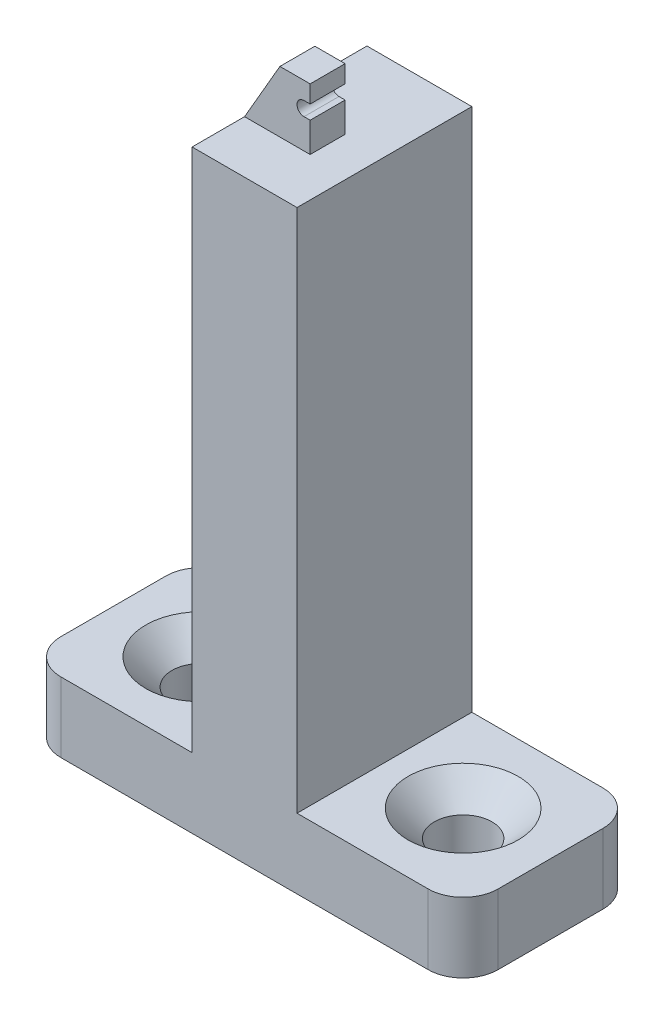
ISO-10303-21;
HEADER;
FILE_DESCRIPTION(('STEP AP214'),'2;1');
FILE_NAME('part.step','',(''),(''),'','','');
FILE_SCHEMA(('AUTOMOTIVE_DESIGN { 1 0 10303 214 1 1 1 1 }'));
ENDSEC;
DATA;
#1=APPLICATION_CONTEXT('core data for automotive mechanical design processes');
#2=APPLICATION_PROTOCOL_DEFINITION('international standard','automotive_design',2000,#1);
#3=PRODUCT_CONTEXT('',#1,'mechanical');
#4=PRODUCT('Part','Part','',(#3));
#5=PRODUCT_RELATED_PRODUCT_CATEGORY('part','',(#4));
#6=PRODUCT_DEFINITION_FORMATION('','',#4);
#7=PRODUCT_DEFINITION_CONTEXT('part definition',#1,'design');
#8=PRODUCT_DEFINITION('design','',#6,#7);
#9=PRODUCT_DEFINITION_SHAPE('','',#8);
#10=(LENGTH_UNIT() NAMED_UNIT(*) SI_UNIT(.MILLI.,.METRE.));
#11=(NAMED_UNIT(*) PLANE_ANGLE_UNIT() SI_UNIT($,.RADIAN.));
#12=(NAMED_UNIT(*) SI_UNIT($,.STERADIAN.) SOLID_ANGLE_UNIT());
#13=UNCERTAINTY_MEASURE_WITH_UNIT(LENGTH_MEASURE(1.E-05),#10,'distance_accuracy_value','');
#14=(GEOMETRIC_REPRESENTATION_CONTEXT(3) GLOBAL_UNCERTAINTY_ASSIGNED_CONTEXT((#13)) GLOBAL_UNIT_ASSIGNED_CONTEXT((#10,
#11,#12)) REPRESENTATION_CONTEXT('',''));
#15=CARTESIAN_POINT('',(0.,0.,0.));
#16=DIRECTION('',(0.,0.,1.));
#17=DIRECTION('',(1.,0.,0.));
#18=AXIS2_PLACEMENT_3D('',#15,#16,#17);
#19=CARTESIAN_POINT('',(0.,8.,0.));
#20=DIRECTION('',(0.,-1.,0.));
#21=DIRECTION('',(0.,0.,-1.));
#22=AXIS2_PLACEMENT_3D('',#19,#20,#21);
#23=PLANE('',#22);
#24=CARTESIAN_POINT('',(-15.,8.,0.));
#25=DIRECTION('',(0.,1.,0.));
#26=DIRECTION('',(0.,0.,1.));
#27=AXIS2_PLACEMENT_3D('',#24,#25,#26);
#28=CIRCLE('',#27,6.3);
#29=CARTESIAN_POINT('',(-15.,8.,6.3));
#30=VERTEX_POINT('',#29);
#31=EDGE_CURVE('E266',#30,#30,#28,.T.);
#32=ORIENTED_EDGE('',*,*,#31,.F.);
#33=EDGE_LOOP('',(#32));
#34=FACE_BOUND('',#33,.T.);
#35=DIRECTION('',(0.,0.,1.));
#36=VECTOR('',#35,1.);
#37=CARTESIAN_POINT('',(-6.,8.,-10.));
#38=LINE('',#37,#36);
#39=CARTESIAN_POINT('',(-6.,8.,-10.));
#40=VERTEX_POINT('',#39);
#41=CARTESIAN_POINT('',(-6.,8.,10.));
#42=VERTEX_POINT('',#41);
#43=EDGE_CURVE('E178',#40,#42,#38,.T.);
#44=ORIENTED_EDGE('',*,*,#43,.F.);
#45=DIRECTION('',(-1.,0.,0.));
#46=VECTOR('',#45,1.);
#47=CARTESIAN_POINT('',(25.,8.,-10.));
#48=LINE('',#47,#46);
#49=CARTESIAN_POINT('',(-21.,8.,-10.));
#50=VERTEX_POINT('',#49);
#51=EDGE_CURVE('E295',#40,#50,#48,.T.);
#52=ORIENTED_EDGE('',*,*,#51,.T.);
#53=CARTESIAN_POINT('',(-21.,8.,-6.));
#54=DIRECTION('',(0.,-1.,0.));
#55=DIRECTION('',(0.,0.,-1.));
#56=AXIS2_PLACEMENT_3D('',#53,#54,#55);
#57=CIRCLE('',#56,4.);
#58=CARTESIAN_POINT('',(-25.,8.,-6.));
#59=VERTEX_POINT('',#58);
#60=EDGE_CURVE('E329',#50,#59,#57,.F.);
#61=ORIENTED_EDGE('',*,*,#60,.T.);
#62=DIRECTION('',(0.,0.,1.));
#63=VECTOR('',#62,1.);
#64=CARTESIAN_POINT('',(-25.,8.,-10.));
#65=LINE('',#64,#63);
#66=CARTESIAN_POINT('',(-25.,8.,6.));
#67=VERTEX_POINT('',#66);
#68=EDGE_CURVE('E285',#59,#67,#65,.T.);
#69=ORIENTED_EDGE('',*,*,#68,.T.);
#70=CARTESIAN_POINT('',(-21.,8.,6.));
#71=DIRECTION('',(0.,-1.,0.));
#72=DIRECTION('',(0.,0.,-1.));
#73=AXIS2_PLACEMENT_3D('',#70,#71,#72);
#74=CIRCLE('',#73,4.);
#75=CARTESIAN_POINT('',(-21.,8.,10.));
#76=VERTEX_POINT('',#75);
#77=EDGE_CURVE('E327',#67,#76,#74,.F.);
#78=ORIENTED_EDGE('',*,*,#77,.T.);
#79=DIRECTION('',(1.,0.,0.));
#80=VECTOR('',#79,1.);
#81=CARTESIAN_POINT('',(25.,8.,9.99999999999999));
#82=LINE('',#81,#80);
#83=EDGE_CURVE('E290',#76,#42,#82,.T.);
#84=ORIENTED_EDGE('',*,*,#83,.T.);
#85=EDGE_LOOP('',(#44,#52,#61,#69,#78,#84));
#86=FACE_BOUND('',#85,.T.);
#87=ADVANCED_FACE('F39',(#34,#86),#23,.F.);
#88=CARTESIAN_POINT('',(15.,8.,0.));
#89=DIRECTION('',(0.,1.,0.));
#90=DIRECTION('',(0.,0.,1.));
#91=AXIS2_PLACEMENT_3D('',#88,#89,#90);
#92=CIRCLE('',#91,6.3);
#93=CARTESIAN_POINT('',(15.,8.,6.3));
#94=VERTEX_POINT('',#93);
#95=EDGE_CURVE('E275',#94,#94,#92,.T.);
#96=ORIENTED_EDGE('',*,*,#95,.F.);
#97=EDGE_LOOP('',(#96));
#98=FACE_BOUND('',#97,.T.);
#99=DIRECTION('',(0.,0.,-1.));
#100=VECTOR('',#99,1.);
#101=CARTESIAN_POINT('',(6.,8.,-10.));
#102=LINE('',#101,#100);
#103=CARTESIAN_POINT('',(6.,8.,10.));
#104=VERTEX_POINT('',#103);
#105=CARTESIAN_POINT('',(6.,8.,-10.));
#106=VERTEX_POINT('',#105);
#107=EDGE_CURVE('E252',#104,#106,#102,.T.);
#108=ORIENTED_EDGE('',*,*,#107,.F.);
#109=CARTESIAN_POINT('',(21.,8.,9.99999999999999));
#110=VERTEX_POINT('',#109);
#111=EDGE_CURVE('E288',#104,#110,#82,.T.);
#112=ORIENTED_EDGE('',*,*,#111,.T.);
#113=CARTESIAN_POINT('',(21.,8.,5.99999999999999));
#114=DIRECTION('',(0.,-1.,0.));
#115=DIRECTION('',(0.,0.,-1.));
#116=AXIS2_PLACEMENT_3D('',#113,#114,#115);
#117=CIRCLE('',#116,4.);
#118=CARTESIAN_POINT('',(25.,8.,5.99999999999999));
#119=VERTEX_POINT('',#118);
#120=EDGE_CURVE('E331',#110,#119,#117,.F.);
#121=ORIENTED_EDGE('',*,*,#120,.T.);
#122=DIRECTION('',(0.,0.,-1.));
#123=VECTOR('',#122,1.);
#124=CARTESIAN_POINT('',(25.,8.,-10.));
#125=LINE('',#124,#123);
#126=CARTESIAN_POINT('',(25.,8.,-6.00000000000001));
#127=VERTEX_POINT('',#126);
#128=EDGE_CURVE('E292',#119,#127,#125,.T.);
#129=ORIENTED_EDGE('',*,*,#128,.T.);
#130=CARTESIAN_POINT('',(21.,8.,-6.));
#131=DIRECTION('',(0.,-1.,0.));
#132=DIRECTION('',(0.,0.,-1.));
#133=AXIS2_PLACEMENT_3D('',#130,#131,#132);
#134=CIRCLE('',#133,4.);
#135=CARTESIAN_POINT('',(21.,8.,-10.));
#136=VERTEX_POINT('',#135);
#137=EDGE_CURVE('E333',#127,#136,#134,.F.);
#138=ORIENTED_EDGE('',*,*,#137,.T.);
#139=EDGE_CURVE('E296',#136,#106,#48,.T.);
#140=ORIENTED_EDGE('',*,*,#139,.T.);
#141=EDGE_LOOP('',(#108,#112,#121,#129,#138,#140));
#142=FACE_BOUND('',#141,.T.);
#143=ADVANCED_FACE('F370',(#98,#142),#23,.F.);
#144=CARTESIAN_POINT('',(-25.,8.,-10.));
#145=DIRECTION('',(1.,0.,0.));
#146=DIRECTION('',(0.,0.,-1.));
#147=AXIS2_PLACEMENT_3D('',#144,#145,#146);
#148=PLANE('',#147);
#149=ORIENTED_EDGE('',*,*,#68,.F.);
#150=DIRECTION('',(0.,-1.,0.));
#151=VECTOR('',#150,1.);
#152=CARTESIAN_POINT('',(-25.,8.,-6.));
#153=LINE('',#152,#151);
#154=CARTESIAN_POINT('',(-25.,0.,-6.));
#155=VERTEX_POINT('',#154);
#156=EDGE_CURVE('E11',#59,#155,#153,.T.);
#157=ORIENTED_EDGE('',*,*,#156,.T.);
#158=DIRECTION('',(0.,0.,1.));
#159=VECTOR('',#158,1.);
#160=CARTESIAN_POINT('',(-25.,0.,-10.));
#161=LINE('',#160,#159);
#162=CARTESIAN_POINT('',(-25.,0.,6.));
#163=VERTEX_POINT('',#162);
#164=EDGE_CURVE('E284',#155,#163,#161,.T.);
#165=ORIENTED_EDGE('',*,*,#164,.T.);
#166=DIRECTION('',(0.,-1.,0.));
#167=VECTOR('',#166,1.);
#168=CARTESIAN_POINT('',(-25.,8.,6.));
#169=LINE('',#168,#167);
#170=EDGE_CURVE('E47',#163,#67,#169,.F.);
#171=ORIENTED_EDGE('',*,*,#170,.T.);
#172=EDGE_LOOP('',(#149,#157,#165,#171));
#173=FACE_BOUND('',#172,.T.);
#174=ADVANCED_FACE('F343',(#173),#148,.F.);
#175=CARTESIAN_POINT('',(25.,8.,9.99999999999999));
#176=DIRECTION('',(0.,0.,-1.));
#177=DIRECTION('',(-1.,0.,0.));
#178=AXIS2_PLACEMENT_3D('',#175,#176,#177);
#179=PLANE('',#178);
#180=DIRECTION('',(1.,0.,0.));
#181=VECTOR('',#180,1.);
#182=CARTESIAN_POINT('',(25.,0.,9.99999999999999));
#183=LINE('',#182,#181);
#184=CARTESIAN_POINT('',(-21.,0.,10.));
#185=VERTEX_POINT('',#184);
#186=CARTESIAN_POINT('',(21.,0.,9.99999999999999));
#187=VERTEX_POINT('',#186);
#188=EDGE_CURVE('E301',#185,#187,#183,.T.);
#189=ORIENTED_EDGE('',*,*,#188,.T.);
#190=DIRECTION('',(0.,-1.,0.));
#191=VECTOR('',#190,1.);
#192=CARTESIAN_POINT('',(21.,8.,9.99999999999999));
#193=LINE('',#192,#191);
#194=EDGE_CURVE('E338',#187,#110,#193,.F.);
#195=ORIENTED_EDGE('',*,*,#194,.T.);
#196=ORIENTED_EDGE('',*,*,#111,.F.);
#197=DIRECTION('',(0.,-1.,0.));
#198=VECTOR('',#197,1.);
#199=CARTESIAN_POINT('',(6.,68.,10.));
#200=LINE('',#199,#198);
#201=CARTESIAN_POINT('',(6.,68.,10.));
#202=VERTEX_POINT('',#201);
#203=EDGE_CURVE('E260',#202,#104,#200,.T.);
#204=ORIENTED_EDGE('',*,*,#203,.F.);
#205=DIRECTION('',(1.,0.,0.));
#206=VECTOR('',#205,1.);
#207=CARTESIAN_POINT('',(6.,68.,10.));
#208=LINE('',#207,#206);
#209=CARTESIAN_POINT('',(-6.,68.,10.));
#210=VERTEX_POINT('',#209);
#211=EDGE_CURVE('E242',#210,#202,#208,.T.);
#212=ORIENTED_EDGE('',*,*,#211,.F.);
#213=DIRECTION('',(0.,-1.,0.));
#214=VECTOR('',#213,1.);
#215=CARTESIAN_POINT('',(-6.,68.,10.));
#216=LINE('',#215,#214);
#217=EDGE_CURVE('E263',#210,#42,#216,.T.);
#218=ORIENTED_EDGE('',*,*,#217,.T.);
#219=ORIENTED_EDGE('',*,*,#83,.F.);
#220=DIRECTION('',(0.,-1.,0.));
#221=VECTOR('',#220,1.);
#222=CARTESIAN_POINT('',(-21.,8.,10.));
#223=LINE('',#222,#221);
#224=EDGE_CURVE('E335',#76,#185,#223,.T.);
#225=ORIENTED_EDGE('',*,*,#224,.T.);
#226=EDGE_LOOP('',(#189,#195,#196,#204,#212,#218,#219,#225));
#227=FACE_BOUND('',#226,.T.);
#228=ADVANCED_FACE('F354',(#227),#179,.F.);
#229=CARTESIAN_POINT('',(25.,8.,-10.));
#230=DIRECTION('',(-1.,0.,0.));
#231=DIRECTION('',(0.,0.,1.));
#232=AXIS2_PLACEMENT_3D('',#229,#230,#231);
#233=PLANE('',#232);
#234=DIRECTION('',(0.,0.,-1.));
#235=VECTOR('',#234,1.);
#236=CARTESIAN_POINT('',(25.,0.,-10.));
#237=LINE('',#236,#235);
#238=CARTESIAN_POINT('',(25.,0.,5.99999999999999));
#239=VERTEX_POINT('',#238);
#240=CARTESIAN_POINT('',(25.,0.,-6.00000000000001));
#241=VERTEX_POINT('',#240);
#242=EDGE_CURVE('E304',#239,#241,#237,.T.);
#243=ORIENTED_EDGE('',*,*,#242,.T.);
#244=DIRECTION('',(0.,-1.,0.));
#245=VECTOR('',#244,1.);
#246=CARTESIAN_POINT('',(25.,8.,-6.00000000000001));
#247=LINE('',#246,#245);
#248=EDGE_CURVE('E325',#241,#127,#247,.F.);
#249=ORIENTED_EDGE('',*,*,#248,.T.);
#250=ORIENTED_EDGE('',*,*,#128,.F.);
#251=DIRECTION('',(0.,-1.,0.));
#252=VECTOR('',#251,1.);
#253=CARTESIAN_POINT('',(25.,8.,5.99999999999999));
#254=LINE('',#253,#252);
#255=EDGE_CURVE('E322',#119,#239,#254,.T.);
#256=ORIENTED_EDGE('',*,*,#255,.T.);
#257=EDGE_LOOP('',(#243,#249,#250,#256));
#258=FACE_BOUND('',#257,.T.);
#259=ADVANCED_FACE('F366',(#258),#233,.F.);
#260=CARTESIAN_POINT('',(25.,8.,-10.));
#261=DIRECTION('',(0.,0.,1.));
#262=DIRECTION('',(1.,0.,0.));
#263=AXIS2_PLACEMENT_3D('',#260,#261,#262);
#264=PLANE('',#263);
#265=ORIENTED_EDGE('',*,*,#139,.F.);
#266=DIRECTION('',(0.,-1.,0.));
#267=VECTOR('',#266,1.);
#268=CARTESIAN_POINT('',(21.,8.,-10.));
#269=LINE('',#268,#267);
#270=CARTESIAN_POINT('',(21.,0.,-10.));
#271=VERTEX_POINT('',#270);
#272=EDGE_CURVE('E311',#136,#271,#269,.T.);
#273=ORIENTED_EDGE('',*,*,#272,.T.);
#274=DIRECTION('',(-1.,0.,0.));
#275=VECTOR('',#274,1.);
#276=CARTESIAN_POINT('',(25.,0.,-10.));
#277=LINE('',#276,#275);
#278=CARTESIAN_POINT('',(-21.,0.,-10.));
#279=VERTEX_POINT('',#278);
#280=EDGE_CURVE('E289',#271,#279,#277,.T.);
#281=ORIENTED_EDGE('',*,*,#280,.T.);
#282=DIRECTION('',(0.,-1.,0.));
#283=VECTOR('',#282,1.);
#284=CARTESIAN_POINT('',(-21.,8.,-10.));
#285=LINE('',#284,#283);
#286=EDGE_CURVE('E298',#279,#50,#285,.F.);
#287=ORIENTED_EDGE('',*,*,#286,.T.);
#288=ORIENTED_EDGE('',*,*,#51,.F.);
#289=DIRECTION('',(0.,-1.,0.));
#290=VECTOR('',#289,1.);
#291=CARTESIAN_POINT('',(-6.,68.,-10.));
#292=LINE('',#291,#290);
#293=CARTESIAN_POINT('',(-6.,68.,-10.));
#294=VERTEX_POINT('',#293);
#295=EDGE_CURVE('E249',#294,#40,#292,.T.);
#296=ORIENTED_EDGE('',*,*,#295,.F.);
#297=DIRECTION('',(-1.,0.,0.));
#298=VECTOR('',#297,1.);
#299=CARTESIAN_POINT('',(6.,68.,-10.));
#300=LINE('',#299,#298);
#301=CARTESIAN_POINT('',(6.,68.,-10.));
#302=VERTEX_POINT('',#301);
#303=EDGE_CURVE('E247',#302,#294,#300,.T.);
#304=ORIENTED_EDGE('',*,*,#303,.F.);
#305=DIRECTION('',(0.,-1.,0.));
#306=VECTOR('',#305,1.);
#307=CARTESIAN_POINT('',(6.,68.,-10.));
#308=LINE('',#307,#306);
#309=EDGE_CURVE('E257',#302,#106,#308,.T.);
#310=ORIENTED_EDGE('',*,*,#309,.T.);
#311=EDGE_LOOP('',(#265,#273,#281,#287,#288,#296,#304,#310));
#312=FACE_BOUND('',#311,.T.);
#313=ADVANCED_FACE('F376',(#312),#264,.F.);
#314=CARTESIAN_POINT('',(0.,0.,0.));
#315=DIRECTION('',(0.,-1.,0.));
#316=DIRECTION('',(0.,0.,-1.));
#317=AXIS2_PLACEMENT_3D('',#314,#315,#316);
#318=PLANE('',#317);
#319=CARTESIAN_POINT('',(-15.,0.,0.));
#320=DIRECTION('',(0.,1.,0.));
#321=DIRECTION('',(0.,0.,1.));
#322=AXIS2_PLACEMENT_3D('',#319,#320,#321);
#323=CIRCLE('',#322,3.3);
#324=CARTESIAN_POINT('',(-15.,0.,3.29999999999999));
#325=VERTEX_POINT('',#324);
#326=EDGE_CURVE('E272',#325,#325,#323,.T.);
#327=ORIENTED_EDGE('',*,*,#326,.T.);
#328=EDGE_LOOP('',(#327));
#329=FACE_BOUND('',#328,.T.);
#330=CARTESIAN_POINT('',(15.,0.,0.));
#331=DIRECTION('',(0.,1.,0.));
#332=DIRECTION('',(0.,0.,1.));
#333=AXIS2_PLACEMENT_3D('',#330,#331,#332);
#334=CIRCLE('',#333,3.3);
#335=CARTESIAN_POINT('',(15.,0.,3.3));
#336=VERTEX_POINT('',#335);
#337=EDGE_CURVE('E281',#336,#336,#334,.T.);
#338=ORIENTED_EDGE('',*,*,#337,.T.);
#339=EDGE_LOOP('',(#338));
#340=FACE_BOUND('',#339,.T.);
#341=ORIENTED_EDGE('',*,*,#280,.F.);
#342=CARTESIAN_POINT('',(21.,0.,-6.));
#343=DIRECTION('',(0.,-1.,0.));
#344=DIRECTION('',(0.,0.,-1.));
#345=AXIS2_PLACEMENT_3D('',#342,#343,#344);
#346=CIRCLE('',#345,4.);
#347=EDGE_CURVE('E320',#271,#241,#346,.T.);
#348=ORIENTED_EDGE('',*,*,#347,.T.);
#349=ORIENTED_EDGE('',*,*,#242,.F.);
#350=CARTESIAN_POINT('',(21.,0.,5.99999999999999));
#351=DIRECTION('',(0.,-1.,0.));
#352=DIRECTION('',(0.,0.,-1.));
#353=AXIS2_PLACEMENT_3D('',#350,#351,#352);
#354=CIRCLE('',#353,4.);
#355=EDGE_CURVE('E318',#239,#187,#354,.T.);
#356=ORIENTED_EDGE('',*,*,#355,.T.);
#357=ORIENTED_EDGE('',*,*,#188,.F.);
#358=CARTESIAN_POINT('',(-21.,0.,6.));
#359=DIRECTION('',(0.,-1.,0.));
#360=DIRECTION('',(0.,0.,-1.));
#361=AXIS2_PLACEMENT_3D('',#358,#359,#360);
#362=CIRCLE('',#361,4.);
#363=EDGE_CURVE('E314',#185,#163,#362,.T.);
#364=ORIENTED_EDGE('',*,*,#363,.T.);
#365=ORIENTED_EDGE('',*,*,#164,.F.);
#366=CARTESIAN_POINT('',(-21.,0.,-6.));
#367=DIRECTION('',(0.,-1.,0.));
#368=DIRECTION('',(0.,0.,-1.));
#369=AXIS2_PLACEMENT_3D('',#366,#367,#368);
#370=CIRCLE('',#369,4.);
#371=EDGE_CURVE('E316',#155,#279,#370,.T.);
#372=ORIENTED_EDGE('',*,*,#371,.T.);
#373=EDGE_LOOP('',(#341,#348,#349,#356,#357,#364,#365,#372));
#374=FACE_BOUND('',#373,.T.);
#375=ADVANCED_FACE('F358',(#329,#340,#374),#318,.T.);
#376=CARTESIAN_POINT('',(15.,8.,0.));
#377=DIRECTION('',(0.,1.,0.));
#378=DIRECTION('',(0.,0.,1.));
#379=AXIS2_PLACEMENT_3D('',#376,#377,#378);
#380=CYLINDRICAL_SURFACE('',#379,3.3);
#381=ORIENTED_EDGE('',*,*,#337,.F.);
#382=EDGE_LOOP('',(#381));
#383=FACE_BOUND('',#382,.T.);
#384=CARTESIAN_POINT('',(15.,5.,0.));
#385=DIRECTION('',(0.,1.,0.));
#386=DIRECTION('',(0.,0.,1.));
#387=AXIS2_PLACEMENT_3D('',#384,#385,#386);
#388=CIRCLE('',#387,3.3);
#389=CARTESIAN_POINT('',(15.,5.,3.3));
#390=VERTEX_POINT('',#389);
#391=EDGE_CURVE('E278',#390,#390,#388,.T.);
#392=ORIENTED_EDGE('',*,*,#391,.T.);
#393=EDGE_LOOP('',(#392));
#394=FACE_BOUND('',#393,.T.);
#395=ADVANCED_FACE('F435',(#383,#394),#380,.F.);
#396=CARTESIAN_POINT('',(15.,8.,0.));
#397=DIRECTION('',(0.,1.,0.));
#398=DIRECTION('',(0.,0.,1.));
#399=AXIS2_PLACEMENT_3D('',#396,#397,#398);
#400=CONICAL_SURFACE('',#399,6.3,0.785398163397449);
#401=ORIENTED_EDGE('',*,*,#391,.F.);
#402=EDGE_LOOP('',(#401));
#403=FACE_BOUND('',#402,.T.);
#404=ORIENTED_EDGE('',*,*,#95,.T.);
#405=EDGE_LOOP('',(#404));
#406=FACE_BOUND('',#405,.T.);
#407=ADVANCED_FACE('F473',(#403,#406),#400,.F.);
#408=CARTESIAN_POINT('',(-15.,8.,0.));
#409=DIRECTION('',(0.,1.,0.));
#410=DIRECTION('',(0.,0.,1.));
#411=AXIS2_PLACEMENT_3D('',#408,#409,#410);
#412=CYLINDRICAL_SURFACE('',#411,3.3);
#413=ORIENTED_EDGE('',*,*,#326,.F.);
#414=EDGE_LOOP('',(#413));
#415=FACE_BOUND('',#414,.T.);
#416=CARTESIAN_POINT('',(-15.,5.,0.));
#417=DIRECTION('',(0.,1.,0.));
#418=DIRECTION('',(0.,0.,1.));
#419=AXIS2_PLACEMENT_3D('',#416,#417,#418);
#420=CIRCLE('',#419,3.3);
#421=CARTESIAN_POINT('',(-15.,5.,3.3));
#422=VERTEX_POINT('',#421);
#423=EDGE_CURVE('E269',#422,#422,#420,.T.);
#424=ORIENTED_EDGE('',*,*,#423,.T.);
#425=EDGE_LOOP('',(#424));
#426=FACE_BOUND('',#425,.T.);
#427=ADVANCED_FACE('F470',(#415,#426),#412,.F.);
#428=CARTESIAN_POINT('',(-15.,8.,0.));
#429=DIRECTION('',(0.,1.,0.));
#430=DIRECTION('',(0.,0.,1.));
#431=AXIS2_PLACEMENT_3D('',#428,#429,#430);
#432=CONICAL_SURFACE('',#431,6.3,0.785398163397449);
#433=ORIENTED_EDGE('',*,*,#423,.F.);
#434=EDGE_LOOP('',(#433));
#435=FACE_BOUND('',#434,.T.);
#436=ORIENTED_EDGE('',*,*,#31,.T.);
#437=EDGE_LOOP('',(#436));
#438=FACE_BOUND('',#437,.T.);
#439=ADVANCED_FACE('F450',(#435,#438),#432,.F.);
#440=CARTESIAN_POINT('',(21.,8.,-6.));
#441=DIRECTION('',(0.,-1.,0.));
#442=DIRECTION('',(0.,0.,-1.));
#443=AXIS2_PLACEMENT_3D('',#440,#441,#442);
#444=CYLINDRICAL_SURFACE('',#443,4.);
#445=ORIENTED_EDGE('',*,*,#137,.F.);
#446=ORIENTED_EDGE('',*,*,#248,.F.);
#447=ORIENTED_EDGE('',*,*,#347,.F.);
#448=ORIENTED_EDGE('',*,*,#272,.F.);
#449=EDGE_LOOP('',(#445,#446,#447,#448));
#450=FACE_BOUND('',#449,.T.);
#451=ADVANCED_FACE('F374',(#450),#444,.T.);
#452=CARTESIAN_POINT('',(21.,8.,5.99999999999999));
#453=DIRECTION('',(0.,-1.,0.));
#454=DIRECTION('',(0.,0.,-1.));
#455=AXIS2_PLACEMENT_3D('',#452,#453,#454);
#456=CYLINDRICAL_SURFACE('',#455,4.);
#457=ORIENTED_EDGE('',*,*,#120,.F.);
#458=ORIENTED_EDGE('',*,*,#194,.F.);
#459=ORIENTED_EDGE('',*,*,#355,.F.);
#460=ORIENTED_EDGE('',*,*,#255,.F.);
#461=EDGE_LOOP('',(#457,#458,#459,#460));
#462=FACE_BOUND('',#461,.T.);
#463=ADVANCED_FACE('F363',(#462),#456,.T.);
#464=CARTESIAN_POINT('',(-21.,8.,-6.));
#465=DIRECTION('',(0.,-1.,0.));
#466=DIRECTION('',(0.,0.,-1.));
#467=AXIS2_PLACEMENT_3D('',#464,#465,#466);
#468=CYLINDRICAL_SURFACE('',#467,4.);
#469=ORIENTED_EDGE('',*,*,#60,.F.);
#470=ORIENTED_EDGE('',*,*,#286,.F.);
#471=ORIENTED_EDGE('',*,*,#371,.F.);
#472=ORIENTED_EDGE('',*,*,#156,.F.);
#473=EDGE_LOOP('',(#469,#470,#471,#472));
#474=FACE_BOUND('',#473,.T.);
#475=ADVANCED_FACE('F379',(#474),#468,.T.);
#476=CARTESIAN_POINT('',(-21.,8.,6.));
#477=DIRECTION('',(0.,-1.,0.));
#478=DIRECTION('',(0.,0.,-1.));
#479=AXIS2_PLACEMENT_3D('',#476,#477,#478);
#480=CYLINDRICAL_SURFACE('',#479,4.);
#481=ORIENTED_EDGE('',*,*,#77,.F.);
#482=ORIENTED_EDGE('',*,*,#170,.F.);
#483=ORIENTED_EDGE('',*,*,#363,.F.);
#484=ORIENTED_EDGE('',*,*,#224,.F.);
#485=EDGE_LOOP('',(#481,#482,#483,#484));
#486=FACE_BOUND('',#485,.T.);
#487=ADVANCED_FACE('F41',(#486),#480,.T.);
#488=CARTESIAN_POINT('',(-6.,68.,-10.));
#489=DIRECTION('',(1.,0.,0.));
#490=DIRECTION('',(0.,0.,-1.));
#491=AXIS2_PLACEMENT_3D('',#488,#489,#490);
#492=PLANE('',#491);
#493=ORIENTED_EDGE('',*,*,#43,.T.);
#494=ORIENTED_EDGE('',*,*,#217,.F.);
#495=DIRECTION('',(0.,0.,1.));
#496=VECTOR('',#495,1.);
#497=CARTESIAN_POINT('',(-6.,68.,-10.));
#498=LINE('',#497,#496);
#499=CARTESIAN_POINT('',(-6.,68.,4.));
#500=VERTEX_POINT('',#499);
#501=EDGE_CURVE('E243',#500,#210,#498,.T.);
#502=ORIENTED_EDGE('',*,*,#501,.F.);
#503=DIRECTION('',(0.,0.,-1.));
#504=VECTOR('',#503,1.);
#505=CARTESIAN_POINT('',(-6.,68.,4.));
#506=LINE('',#505,#504);
#507=CARTESIAN_POINT('',(-6.,68.,0.));
#508=VERTEX_POINT('',#507);
#509=EDGE_CURVE('E210',#500,#508,#506,.T.);
#510=ORIENTED_EDGE('',*,*,#509,.T.);
#511=EDGE_CURVE('E240',#294,#508,#498,.T.);
#512=ORIENTED_EDGE('',*,*,#511,.F.);
#513=ORIENTED_EDGE('',*,*,#295,.T.);
#514=EDGE_LOOP('',(#493,#494,#502,#510,#512,#513));
#515=FACE_BOUND('',#514,.T.);
#516=ADVANCED_FACE('F385',(#515),#492,.F.);
#517=CARTESIAN_POINT('',(6.,68.,-10.));
#518=DIRECTION('',(-1.,0.,0.));
#519=DIRECTION('',(0.,0.,1.));
#520=AXIS2_PLACEMENT_3D('',#517,#518,#519);
#521=PLANE('',#520);
#522=ORIENTED_EDGE('',*,*,#107,.T.);
#523=ORIENTED_EDGE('',*,*,#309,.F.);
#524=DIRECTION('',(0.,0.,-1.));
#525=VECTOR('',#524,1.);
#526=CARTESIAN_POINT('',(6.,68.,-10.));
#527=LINE('',#526,#525);
#528=EDGE_CURVE('E245',#202,#302,#527,.T.);
#529=ORIENTED_EDGE('',*,*,#528,.F.);
#530=ORIENTED_EDGE('',*,*,#203,.T.);
#531=EDGE_LOOP('',(#522,#523,#529,#530));
#532=FACE_BOUND('',#531,.T.);
#533=ADVANCED_FACE('F458',(#532),#521,.F.);
#534=CARTESIAN_POINT('',(0.,68.,0.));
#535=DIRECTION('',(0.,-1.,0.));
#536=DIRECTION('',(0.,0.,-1.));
#537=AXIS2_PLACEMENT_3D('',#534,#535,#536);
#538=PLANE('',#537);
#539=ORIENTED_EDGE('',*,*,#511,.T.);
#540=DIRECTION('',(1.,0.,0.));
#541=VECTOR('',#540,1.);
#542=CARTESIAN_POINT('',(1.5,68.,0.));
#543=LINE('',#542,#541);
#544=CARTESIAN_POINT('',(1.5,68.,0.));
#545=VERTEX_POINT('',#544);
#546=EDGE_CURVE('E54',#508,#545,#543,.T.);
#547=ORIENTED_EDGE('',*,*,#546,.T.);
#548=DIRECTION('',(0.,0.,-1.));
#549=VECTOR('',#548,1.);
#550=CARTESIAN_POINT('',(1.5,68.,4.));
#551=LINE('',#550,#549);
#552=CARTESIAN_POINT('',(1.5,68.,4.));
#553=VERTEX_POINT('',#552);
#554=EDGE_CURVE('E174',#553,#545,#551,.T.);
#555=ORIENTED_EDGE('',*,*,#554,.F.);
#556=DIRECTION('',(1.,0.,0.));
#557=VECTOR('',#556,1.);
#558=CARTESIAN_POINT('',(1.5,68.,4.));
#559=LINE('',#558,#557);
#560=EDGE_CURVE('E60',#500,#553,#559,.T.);
#561=ORIENTED_EDGE('',*,*,#560,.F.);
#562=ORIENTED_EDGE('',*,*,#501,.T.);
#563=ORIENTED_EDGE('',*,*,#211,.T.);
#564=ORIENTED_EDGE('',*,*,#528,.T.);
#565=ORIENTED_EDGE('',*,*,#303,.T.);
#566=EDGE_LOOP('',(#539,#547,#555,#561,#562,#563,#564,#565));
#567=FACE_BOUND('',#566,.T.);
#568=ADVANCED_FACE('F176',(#567),#538,.F.);
#569=CARTESIAN_POINT('',(1.5,71.4,4.));
#570=DIRECTION('',(-1.,0.,0.));
#571=DIRECTION('',(0.,-1.,0.));
#572=AXIS2_PLACEMENT_3D('',#569,#570,#571);
#573=PLANE('',#572);
#574=DIRECTION('',(0.,1.,0.));
#575=VECTOR('',#574,1.);
#576=CARTESIAN_POINT('',(1.5,71.4,0.));
#577=LINE('',#576,#575);
#578=CARTESIAN_POINT('',(1.5,71.4,0.));
#579=VERTEX_POINT('',#578);
#580=EDGE_CURVE('E212',#545,#579,#577,.T.);
#581=ORIENTED_EDGE('',*,*,#580,.T.);
#582=DIRECTION('',(0.,0.,-1.));
#583=VECTOR('',#582,1.);
#584=CARTESIAN_POINT('',(1.5,71.4,4.));
#585=LINE('',#584,#583);
#586=CARTESIAN_POINT('',(1.5,71.4,4.));
#587=VERTEX_POINT('',#586);
#588=EDGE_CURVE('E179',#587,#579,#585,.T.);
#589=ORIENTED_EDGE('',*,*,#588,.F.);
#590=DIRECTION('',(0.,1.,0.));
#591=VECTOR('',#590,1.);
#592=CARTESIAN_POINT('',(1.5,71.4,4.));
#593=LINE('',#592,#591);
#594=EDGE_CURVE('E182',#553,#587,#593,.T.);
#595=ORIENTED_EDGE('',*,*,#594,.F.);
#596=ORIENTED_EDGE('',*,*,#554,.T.);
#597=EDGE_LOOP('',(#581,#589,#595,#596));
#598=FACE_BOUND('',#597,.T.);
#599=ADVANCED_FACE('F183',(#598),#573,.F.);
#600=CARTESIAN_POINT('',(0.8,71.4,4.));
#601=DIRECTION('',(0.,-1.,0.));
#602=DIRECTION('',(0.,0.,-1.));
#603=AXIS2_PLACEMENT_3D('',#600,#601,#602);
#604=PLANE('',#603);
#605=DIRECTION('',(-1.,0.,0.));
#606=VECTOR('',#605,1.);
#607=CARTESIAN_POINT('',(0.8,71.4,0.));
#608=LINE('',#607,#606);
#609=CARTESIAN_POINT('',(0.8,71.4,0.));
#610=VERTEX_POINT('',#609);
#611=EDGE_CURVE('E214',#579,#610,#608,.T.);
#612=ORIENTED_EDGE('',*,*,#611,.T.);
#613=DIRECTION('',(0.,0.,-1.));
#614=VECTOR('',#613,1.);
#615=CARTESIAN_POINT('',(0.8,71.4,4.));
#616=LINE('',#615,#614);
#617=CARTESIAN_POINT('',(0.8,71.4,4.));
#618=VERTEX_POINT('',#617);
#619=EDGE_CURVE('E236',#618,#610,#616,.T.);
#620=ORIENTED_EDGE('',*,*,#619,.F.);
#621=DIRECTION('',(-1.,0.,0.));
#622=VECTOR('',#621,1.);
#623=CARTESIAN_POINT('',(0.8,71.4,4.));
#624=LINE('',#623,#622);
#625=EDGE_CURVE('E187',#587,#618,#624,.T.);
#626=ORIENTED_EDGE('',*,*,#625,.F.);
#627=ORIENTED_EDGE('',*,*,#588,.T.);
#628=EDGE_LOOP('',(#612,#620,#626,#627));
#629=FACE_BOUND('',#628,.T.);
#630=ADVANCED_FACE('F397',(#629),#604,.F.);
#631=CARTESIAN_POINT('',(0.8,72.2,4.));
#632=DIRECTION('',(0.,0.,-1.));
#633=DIRECTION('',(-1.,0.,0.));
#634=AXIS2_PLACEMENT_3D('',#631,#632,#633);
#635=CYLINDRICAL_SURFACE('',#634,0.799999999999995);
#636=CARTESIAN_POINT('',(0.8,72.2,0.));
#637=DIRECTION('',(0.,0.,-1.));
#638=DIRECTION('',(1.,0.,0.));
#639=AXIS2_PLACEMENT_3D('',#636,#637,#638);
#640=CIRCLE('',#639,0.799999999999995);
#641=CARTESIAN_POINT('',(0.8,73.,0.));
#642=VERTEX_POINT('',#641);
#643=EDGE_CURVE('E216',#610,#642,#640,.T.);
#644=ORIENTED_EDGE('',*,*,#643,.T.);
#645=DIRECTION('',(0.,0.,-1.));
#646=VECTOR('',#645,1.);
#647=CARTESIAN_POINT('',(0.8,73.,4.));
#648=LINE('',#647,#646);
#649=CARTESIAN_POINT('',(0.8,73.,4.));
#650=VERTEX_POINT('',#649);
#651=EDGE_CURVE('E233',#650,#642,#648,.T.);
#652=ORIENTED_EDGE('',*,*,#651,.F.);
#653=CARTESIAN_POINT('',(0.8,72.2,4.));
#654=DIRECTION('',(0.,0.,-1.));
#655=DIRECTION('',(1.,0.,0.));
#656=AXIS2_PLACEMENT_3D('',#653,#654,#655);
#657=CIRCLE('',#656,0.799999999999995);
#658=EDGE_CURVE('E201',#618,#650,#657,.T.);
#659=ORIENTED_EDGE('',*,*,#658,.F.);
#660=ORIENTED_EDGE('',*,*,#619,.T.);
#661=EDGE_LOOP('',(#644,#652,#659,#660));
#662=FACE_BOUND('',#661,.T.);
#663=ADVANCED_FACE('F404',(#662),#635,.F.);
#664=CARTESIAN_POINT('',(0.8,73.,4.));
#665=DIRECTION('',(0.,1.,0.));
#666=DIRECTION('',(0.,0.,1.));
#667=AXIS2_PLACEMENT_3D('',#664,#665,#666);
#668=PLANE('',#667);
#669=DIRECTION('',(1.,0.,0.));
#670=VECTOR('',#669,1.);
#671=CARTESIAN_POINT('',(0.8,73.,0.));
#672=LINE('',#671,#670);
#673=CARTESIAN_POINT('',(1.5,73.,0.));
#674=VERTEX_POINT('',#673);
#675=EDGE_CURVE('E218',#642,#674,#672,.T.);
#676=ORIENTED_EDGE('',*,*,#675,.T.);
#677=DIRECTION('',(0.,0.,-1.));
#678=VECTOR('',#677,1.);
#679=CARTESIAN_POINT('',(1.5,73.,4.));
#680=LINE('',#679,#678);
#681=CARTESIAN_POINT('',(1.5,73.,4.));
#682=VERTEX_POINT('',#681);
#683=EDGE_CURVE('E230',#682,#674,#680,.T.);
#684=ORIENTED_EDGE('',*,*,#683,.F.);
#685=DIRECTION('',(1.,0.,0.));
#686=VECTOR('',#685,1.);
#687=CARTESIAN_POINT('',(0.8,73.,4.));
#688=LINE('',#687,#686);
#689=EDGE_CURVE('E203',#650,#682,#688,.T.);
#690=ORIENTED_EDGE('',*,*,#689,.F.);
#691=ORIENTED_EDGE('',*,*,#651,.T.);
#692=EDGE_LOOP('',(#676,#684,#690,#691));
#693=FACE_BOUND('',#692,.T.);
#694=ADVANCED_FACE('F407',(#693),#668,.F.);
#695=CARTESIAN_POINT('',(1.5,75.,4.));
#696=DIRECTION('',(-1.,0.,0.));
#697=DIRECTION('',(0.,-1.,0.));
#698=AXIS2_PLACEMENT_3D('',#695,#696,#697);
#699=PLANE('',#698);
#700=DIRECTION('',(0.,1.,0.));
#701=VECTOR('',#700,1.);
#702=CARTESIAN_POINT('',(1.5,75.,0.));
#703=LINE('',#702,#701);
#704=CARTESIAN_POINT('',(1.5,75.,0.));
#705=VERTEX_POINT('',#704);
#706=EDGE_CURVE('E220',#674,#705,#703,.T.);
#707=ORIENTED_EDGE('',*,*,#706,.T.);
#708=DIRECTION('',(0.,0.,-1.));
#709=VECTOR('',#708,1.);
#710=CARTESIAN_POINT('',(1.5,75.,4.));
#711=LINE('',#710,#709);
#712=CARTESIAN_POINT('',(1.5,75.,4.));
#713=VERTEX_POINT('',#712);
#714=EDGE_CURVE('E227',#713,#705,#711,.T.);
#715=ORIENTED_EDGE('',*,*,#714,.F.);
#716=DIRECTION('',(0.,1.,0.));
#717=VECTOR('',#716,1.);
#718=CARTESIAN_POINT('',(1.5,75.,4.));
#719=LINE('',#718,#717);
#720=EDGE_CURVE('E205',#682,#713,#719,.T.);
#721=ORIENTED_EDGE('',*,*,#720,.F.);
#722=ORIENTED_EDGE('',*,*,#683,.T.);
#723=EDGE_LOOP('',(#707,#715,#721,#722));
#724=FACE_BOUND('',#723,.T.);
#725=ADVANCED_FACE('F412',(#724),#699,.F.);
#726=CARTESIAN_POINT('',(-1.95854811567257,75.,4.));
#727=DIRECTION('',(0.,-1.,0.));
#728=DIRECTION('',(0.,0.,-1.));
#729=AXIS2_PLACEMENT_3D('',#726,#727,#728);
#730=PLANE('',#729);
#731=DIRECTION('',(-1.,0.,0.));
#732=VECTOR('',#731,1.);
#733=CARTESIAN_POINT('',(-1.95854811567257,75.,0.));
#734=LINE('',#733,#732);
#735=CARTESIAN_POINT('',(-1.95854811567257,75.,0.));
#736=VERTEX_POINT('',#735);
#737=EDGE_CURVE('E197',#705,#736,#734,.T.);
#738=ORIENTED_EDGE('',*,*,#737,.T.);
#739=DIRECTION('',(0.,0.,-1.));
#740=VECTOR('',#739,1.);
#741=CARTESIAN_POINT('',(-1.95854811567257,75.,4.));
#742=LINE('',#741,#740);
#743=CARTESIAN_POINT('',(-1.95854811567257,75.,4.));
#744=VERTEX_POINT('',#743);
#745=EDGE_CURVE('E224',#744,#736,#742,.T.);
#746=ORIENTED_EDGE('',*,*,#745,.F.);
#747=DIRECTION('',(-1.,0.,0.));
#748=VECTOR('',#747,1.);
#749=CARTESIAN_POINT('',(-1.95854811567257,75.,4.));
#750=LINE('',#749,#748);
#751=EDGE_CURVE('E207',#713,#744,#750,.T.);
#752=ORIENTED_EDGE('',*,*,#751,.F.);
#753=ORIENTED_EDGE('',*,*,#714,.T.);
#754=EDGE_LOOP('',(#738,#746,#752,#753));
#755=FACE_BOUND('',#754,.T.);
#756=ADVANCED_FACE('F415',(#755),#730,.F.);
#757=CARTESIAN_POINT('',(-6.,68.,4.));
#758=DIRECTION('',(0.866025403784436,-0.500000000000004,0.));
#759=DIRECTION('',(0.500000000000004,0.866025403784436,0.));
#760=AXIS2_PLACEMENT_3D('',#757,#758,#759);
#761=PLANE('',#760);
#762=DIRECTION('',(-0.500000000000004,-0.866025403784436,0.));
#763=VECTOR('',#762,1.);
#764=CARTESIAN_POINT('',(-6.,68.,0.));
#765=LINE('',#764,#763);
#766=EDGE_CURVE('E194',#736,#508,#765,.T.);
#767=ORIENTED_EDGE('',*,*,#766,.T.);
#768=ORIENTED_EDGE('',*,*,#509,.F.);
#769=DIRECTION('',(-0.500000000000004,-0.866025403784436,0.));
#770=VECTOR('',#769,1.);
#771=CARTESIAN_POINT('',(-6.,68.,4.));
#772=LINE('',#771,#770);
#773=EDGE_CURVE('E192',#744,#500,#772,.T.);
#774=ORIENTED_EDGE('',*,*,#773,.F.);
#775=ORIENTED_EDGE('',*,*,#745,.T.);
#776=EDGE_LOOP('',(#767,#768,#774,#775));
#777=FACE_BOUND('',#776,.T.);
#778=ADVANCED_FACE('F389',(#777),#761,.F.);
#779=CARTESIAN_POINT('',(0.8,72.2,4.));
#780=DIRECTION('',(0.,0.,1.));
#781=DIRECTION('',(1.,0.,0.));
#782=AXIS2_PLACEMENT_3D('',#779,#780,#781);
#783=PLANE('',#782);
#784=ORIENTED_EDGE('',*,*,#560,.T.);
#785=ORIENTED_EDGE('',*,*,#594,.T.);
#786=ORIENTED_EDGE('',*,*,#625,.T.);
#787=ORIENTED_EDGE('',*,*,#658,.T.);
#788=ORIENTED_EDGE('',*,*,#689,.T.);
#789=ORIENTED_EDGE('',*,*,#720,.T.);
#790=ORIENTED_EDGE('',*,*,#751,.T.);
#791=ORIENTED_EDGE('',*,*,#773,.T.);
#792=EDGE_LOOP('',(#784,#785,#786,#787,#788,#789,#790,#791));
#793=FACE_BOUND('',#792,.T.);
#794=ADVANCED_FACE('F190',(#793),#783,.T.);
#795=CARTESIAN_POINT('',(0.8,72.2,0.));
#796=DIRECTION('',(0.,0.,1.));
#797=DIRECTION('',(1.,0.,0.));
#798=AXIS2_PLACEMENT_3D('',#795,#796,#797);
#799=PLANE('',#798);
#800=ORIENTED_EDGE('',*,*,#546,.F.);
#801=ORIENTED_EDGE('',*,*,#766,.F.);
#802=ORIENTED_EDGE('',*,*,#737,.F.);
#803=ORIENTED_EDGE('',*,*,#706,.F.);
#804=ORIENTED_EDGE('',*,*,#675,.F.);
#805=ORIENTED_EDGE('',*,*,#643,.F.);
#806=ORIENTED_EDGE('',*,*,#611,.F.);
#807=ORIENTED_EDGE('',*,*,#580,.F.);
#808=EDGE_LOOP('',(#800,#801,#802,#803,#804,#805,#806,#807));
#809=FACE_BOUND('',#808,.T.);
#810=ADVANCED_FACE('F393',(#809),#799,.F.);
#811=CLOSED_SHELL('',(#87,#143,#174,#228,#259,#313,#375,#395,#407,#427,#439,#451,#463,#475,#487,
#516,#533,#568,#599,#630,#663,#694,#725,#756,#778,#794,#810));
#812=MANIFOLD_SOLID_BREP('B2',#811);
#813=ADVANCED_BREP_SHAPE_REPRESENTATION('',(#18,#812),#14);
#814=SHAPE_DEFINITION_REPRESENTATION(#9,#813);
ENDSEC;
END-ISO-10303-21;
